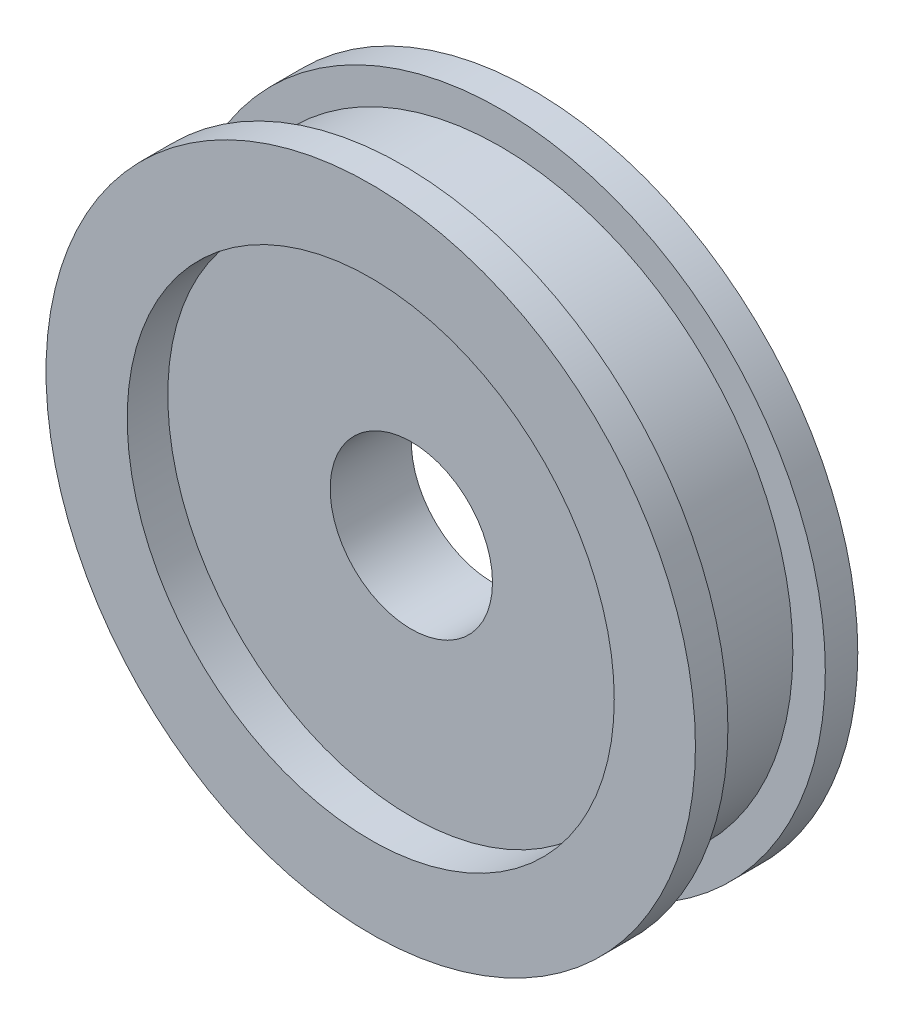
ISO-10303-21;
HEADER;
FILE_DESCRIPTION(('STEP AP214'),'2;1');
FILE_NAME('part.step','',(''),(''),'','','');
FILE_SCHEMA(('AUTOMOTIVE_DESIGN { 1 0 10303 214 1 1 1 1 }'));
ENDSEC;
DATA;
#1=APPLICATION_CONTEXT('core data for automotive mechanical design processes');
#2=APPLICATION_PROTOCOL_DEFINITION('international standard','automotive_design',2000,#1);
#3=PRODUCT_CONTEXT('',#1,'mechanical');
#4=PRODUCT('Part','Part','',(#3));
#5=PRODUCT_RELATED_PRODUCT_CATEGORY('part','',(#4));
#6=PRODUCT_DEFINITION_FORMATION('','',#4);
#7=PRODUCT_DEFINITION_CONTEXT('part definition',#1,'design');
#8=PRODUCT_DEFINITION('design','',#6,#7);
#9=PRODUCT_DEFINITION_SHAPE('','',#8);
#10=(LENGTH_UNIT() NAMED_UNIT(*) SI_UNIT(.MILLI.,.METRE.));
#11=(NAMED_UNIT(*) PLANE_ANGLE_UNIT() SI_UNIT($,.RADIAN.));
#12=(NAMED_UNIT(*) SI_UNIT($,.STERADIAN.) SOLID_ANGLE_UNIT());
#13=UNCERTAINTY_MEASURE_WITH_UNIT(LENGTH_MEASURE(1.E-05),#10,'distance_accuracy_value','');
#14=(GEOMETRIC_REPRESENTATION_CONTEXT(3) GLOBAL_UNCERTAINTY_ASSIGNED_CONTEXT((#13)) GLOBAL_UNIT_ASSIGNED_CONTEXT((#10,
#11,#12)) REPRESENTATION_CONTEXT('',''));
#15=CARTESIAN_POINT('',(0.,0.,0.));
#16=DIRECTION('',(0.,0.,1.));
#17=DIRECTION('',(1.,0.,0.));
#18=AXIS2_PLACEMENT_3D('',#15,#16,#17);
#19=CARTESIAN_POINT('',(0.,0.,5.));
#20=DIRECTION('',(0.,0.,-1.));
#21=DIRECTION('',(-1.,0.,0.));
#22=AXIS2_PLACEMENT_3D('',#19,#20,#21);
#23=CYLINDRICAL_SURFACE('',#22,20.);
#24=CARTESIAN_POINT('',(0.,0.,5.));
#25=DIRECTION('',(0.,0.,1.));
#26=DIRECTION('',(1.,0.,0.));
#27=AXIS2_PLACEMENT_3D('',#24,#25,#26);
#28=CIRCLE('',#27,20.);
#29=CARTESIAN_POINT('',(20.,0.,5.));
#30=VERTEX_POINT('',#29);
#31=EDGE_CURVE('E46',#30,#30,#28,.T.);
#32=ORIENTED_EDGE('',*,*,#31,.F.);
#33=EDGE_LOOP('',(#32));
#34=FACE_BOUND('',#33,.T.);
#35=CARTESIAN_POINT('',(0.,0.,3.));
#36=DIRECTION('',(0.,0.,1.));
#37=DIRECTION('',(1.,0.,0.));
#38=AXIS2_PLACEMENT_3D('',#35,#36,#37);
#39=CIRCLE('',#38,20.);
#40=CARTESIAN_POINT('',(20.,0.,3.));
#41=VERTEX_POINT('',#40);
#42=EDGE_CURVE('E67',#41,#41,#39,.T.);
#43=ORIENTED_EDGE('',*,*,#42,.T.);
#44=EDGE_LOOP('',(#43));
#45=FACE_BOUND('',#44,.T.);
#46=ADVANCED_FACE('F39',(#34,#45),#23,.T.);
#47=CARTESIAN_POINT('',(0.,0.,-5.));
#48=DIRECTION('',(0.,0.,1.));
#49=DIRECTION('',(1.,0.,0.));
#50=AXIS2_PLACEMENT_3D('',#47,#48,#49);
#51=CIRCLE('',#50,20.);
#52=CARTESIAN_POINT('',(20.,0.,-5.));
#53=VERTEX_POINT('',#52);
#54=EDGE_CURVE('E50',#53,#53,#51,.T.);
#55=ORIENTED_EDGE('',*,*,#54,.T.);
#56=EDGE_LOOP('',(#55));
#57=FACE_BOUND('',#56,.T.);
#58=CARTESIAN_POINT('',(0.,0.,-3.));
#59=DIRECTION('',(0.,0.,1.));
#60=DIRECTION('',(1.,0.,0.));
#61=AXIS2_PLACEMENT_3D('',#58,#59,#60);
#62=CIRCLE('',#61,20.);
#63=CARTESIAN_POINT('',(20.,0.,-3.));
#64=VERTEX_POINT('',#63);
#65=EDGE_CURVE('E76',#64,#64,#62,.T.);
#66=ORIENTED_EDGE('',*,*,#65,.F.);
#67=EDGE_LOOP('',(#66));
#68=FACE_BOUND('',#67,.T.);
#69=ADVANCED_FACE('F83',(#57,#68),#23,.T.);
#70=CARTESIAN_POINT('',(0.,0.,0.));
#71=DIRECTION('',(0.,0.,1.));
#72=DIRECTION('',(1.,0.,0.));
#73=AXIS2_PLACEMENT_3D('',#70,#71,#72);
#74=CYLINDRICAL_SURFACE('',#73,15.);
#75=CARTESIAN_POINT('',(0.,0.,-5.));
#76=DIRECTION('',(0.,0.,-1.));
#77=DIRECTION('',(-1.,0.,0.));
#78=AXIS2_PLACEMENT_3D('',#75,#76,#77);
#79=CIRCLE('',#78,15.);
#80=CARTESIAN_POINT('',(-15.,0.,-5.));
#81=VERTEX_POINT('',#80);
#82=EDGE_CURVE('E58',#81,#81,#79,.T.);
#83=ORIENTED_EDGE('',*,*,#82,.T.);
#84=EDGE_LOOP('',(#83));
#85=FACE_BOUND('',#84,.T.);
#86=CARTESIAN_POINT('',(0.,0.,-2.5));
#87=DIRECTION('',(0.,0.,1.));
#88=DIRECTION('',(1.,0.,0.));
#89=AXIS2_PLACEMENT_3D('',#86,#87,#88);
#90=CIRCLE('',#89,15.);
#91=CARTESIAN_POINT('',(15.,0.,-2.5));
#92=VERTEX_POINT('',#91);
#93=EDGE_CURVE('E10',#92,#92,#90,.F.);
#94=ORIENTED_EDGE('',*,*,#93,.F.);
#95=EDGE_LOOP('',(#94));
#96=FACE_BOUND('',#95,.T.);
#97=ADVANCED_FACE('F85',(#85,#96),#74,.F.);
#98=CARTESIAN_POINT('',(0.,0.,5.));
#99=DIRECTION('',(0.,0.,1.));
#100=DIRECTION('',(1.,0.,0.));
#101=AXIS2_PLACEMENT_3D('',#98,#99,#100);
#102=PLANE('',#101);
#103=CARTESIAN_POINT('',(0.,0.,5.));
#104=DIRECTION('',(0.,0.,1.));
#105=DIRECTION('',(1.,0.,0.));
#106=AXIS2_PLACEMENT_3D('',#103,#104,#105);
#107=CIRCLE('',#106,15.);
#108=CARTESIAN_POINT('',(15.,0.,5.));
#109=VERTEX_POINT('',#108);
#110=EDGE_CURVE('E54',#109,#109,#107,.T.);
#111=ORIENTED_EDGE('',*,*,#110,.F.);
#112=EDGE_LOOP('',(#111));
#113=FACE_BOUND('',#112,.T.);
#114=ORIENTED_EDGE('',*,*,#31,.T.);
#115=EDGE_LOOP('',(#114));
#116=FACE_BOUND('',#115,.T.);
#117=ADVANCED_FACE('F92',(#113,#116),#102,.T.);
#118=CARTESIAN_POINT('',(0.,0.,-5.));
#119=DIRECTION('',(0.,0.,1.));
#120=DIRECTION('',(1.,0.,0.));
#121=AXIS2_PLACEMENT_3D('',#118,#119,#120);
#122=PLANE('',#121);
#123=ORIENTED_EDGE('',*,*,#82,.F.);
#124=EDGE_LOOP('',(#123));
#125=FACE_BOUND('',#124,.T.);
#126=ORIENTED_EDGE('',*,*,#54,.F.);
#127=EDGE_LOOP('',(#126));
#128=FACE_BOUND('',#127,.T.);
#129=ADVANCED_FACE('F99',(#125,#128),#122,.F.);
#130=CARTESIAN_POINT('',(0.,0.,2.5));
#131=DIRECTION('',(0.,0.,1.));
#132=DIRECTION('',(1.,0.,0.));
#133=AXIS2_PLACEMENT_3D('',#130,#131,#132);
#134=CIRCLE('',#133,15.);
#135=CARTESIAN_POINT('',(15.,0.,2.5));
#136=VERTEX_POINT('',#135);
#137=EDGE_CURVE('E61',#136,#136,#134,.T.);
#138=ORIENTED_EDGE('',*,*,#137,.F.);
#139=EDGE_LOOP('',(#138));
#140=FACE_BOUND('',#139,.T.);
#141=ORIENTED_EDGE('',*,*,#110,.T.);
#142=EDGE_LOOP('',(#141));
#143=FACE_BOUND('',#142,.T.);
#144=ADVANCED_FACE('F95',(#140,#143),#74,.F.);
#145=CARTESIAN_POINT('',(0.,0.,-2.5));
#146=DIRECTION('',(0.,0.,1.));
#147=DIRECTION('',(1.,0.,0.));
#148=AXIS2_PLACEMENT_3D('',#145,#146,#147);
#149=PLANE('',#148);
#150=CARTESIAN_POINT('',(0.,0.,-2.5));
#151=DIRECTION('',(0.,0.,1.));
#152=DIRECTION('',(1.,0.,0.));
#153=AXIS2_PLACEMENT_3D('',#150,#151,#152);
#154=CIRCLE('',#153,5.);
#155=CARTESIAN_POINT('',(5.,0.,-2.5));
#156=VERTEX_POINT('',#155);
#157=EDGE_CURVE('E42',#156,#156,#154,.T.);
#158=ORIENTED_EDGE('',*,*,#157,.T.);
#159=EDGE_LOOP('',(#158));
#160=FACE_BOUND('',#159,.T.);
#161=ORIENTED_EDGE('',*,*,#93,.T.);
#162=EDGE_LOOP('',(#161));
#163=FACE_BOUND('',#162,.T.);
#164=ADVANCED_FACE('F106',(#160,#163),#149,.F.);
#165=CARTESIAN_POINT('',(0.,0.,2.5));
#166=DIRECTION('',(0.,0.,1.));
#167=DIRECTION('',(1.,0.,0.));
#168=AXIS2_PLACEMENT_3D('',#165,#166,#167);
#169=PLANE('',#168);
#170=CARTESIAN_POINT('',(0.,0.,2.5));
#171=DIRECTION('',(0.,0.,1.));
#172=DIRECTION('',(1.,0.,0.));
#173=AXIS2_PLACEMENT_3D('',#170,#171,#172);
#174=CIRCLE('',#173,5.);
#175=CARTESIAN_POINT('',(5.,0.,2.5));
#176=VERTEX_POINT('',#175);
#177=EDGE_CURVE('E64',#176,#176,#174,.T.);
#178=ORIENTED_EDGE('',*,*,#177,.F.);
#179=EDGE_LOOP('',(#178));
#180=FACE_BOUND('',#179,.T.);
#181=ORIENTED_EDGE('',*,*,#137,.T.);
#182=EDGE_LOOP('',(#181));
#183=FACE_BOUND('',#182,.T.);
#184=ADVANCED_FACE('F114',(#180,#183),#169,.T.);
#185=CARTESIAN_POINT('',(0.,0.,-5.));
#186=DIRECTION('',(0.,0.,1.));
#187=DIRECTION('',(1.,0.,0.));
#188=AXIS2_PLACEMENT_3D('',#185,#186,#187);
#189=CYLINDRICAL_SURFACE('',#188,5.);
#190=ORIENTED_EDGE('',*,*,#177,.T.);
#191=EDGE_LOOP('',(#190));
#192=FACE_BOUND('',#191,.T.);
#193=ORIENTED_EDGE('',*,*,#157,.F.);
#194=EDGE_LOOP('',(#193));
#195=FACE_BOUND('',#194,.T.);
#196=ADVANCED_FACE('F118',(#192,#195),#189,.F.);
#197=CARTESIAN_POINT('',(-20.,0.,3.));
#198=DIRECTION('',(0.,0.,-1.));
#199=DIRECTION('',(-1.,0.,0.));
#200=AXIS2_PLACEMENT_3D('',#197,#198,#199);
#201=PLANE('',#200);
#202=CARTESIAN_POINT('',(0.,0.,3.));
#203=DIRECTION('',(0.,0.,1.));
#204=DIRECTION('',(1.,0.,0.));
#205=AXIS2_PLACEMENT_3D('',#202,#203,#204);
#206=CIRCLE('',#205,18.);
#207=CARTESIAN_POINT('',(18.,0.,3.));
#208=VERTEX_POINT('',#207);
#209=EDGE_CURVE('E70',#208,#208,#206,.T.);
#210=ORIENTED_EDGE('',*,*,#209,.T.);
#211=EDGE_LOOP('',(#210));
#212=FACE_BOUND('',#211,.T.);
#213=ORIENTED_EDGE('',*,*,#42,.F.);
#214=EDGE_LOOP('',(#213));
#215=FACE_BOUND('',#214,.T.);
#216=ADVANCED_FACE('F122',(#212,#215),#201,.T.);
#217=CARTESIAN_POINT('',(0.,0.,0.));
#218=DIRECTION('',(0.,0.,1.));
#219=DIRECTION('',(1.,0.,0.));
#220=AXIS2_PLACEMENT_3D('',#217,#218,#219);
#221=CYLINDRICAL_SURFACE('',#220,18.);
#222=CARTESIAN_POINT('',(0.,0.,-3.));
#223=DIRECTION('',(0.,0.,1.));
#224=DIRECTION('',(1.,0.,0.));
#225=AXIS2_PLACEMENT_3D('',#222,#223,#224);
#226=CIRCLE('',#225,18.);
#227=CARTESIAN_POINT('',(18.,0.,-3.));
#228=VERTEX_POINT('',#227);
#229=EDGE_CURVE('E73',#228,#228,#226,.T.);
#230=ORIENTED_EDGE('',*,*,#229,.T.);
#231=EDGE_LOOP('',(#230));
#232=FACE_BOUND('',#231,.T.);
#233=ORIENTED_EDGE('',*,*,#209,.F.);
#234=EDGE_LOOP('',(#233));
#235=FACE_BOUND('',#234,.T.);
#236=ADVANCED_FACE('F125',(#232,#235),#221,.T.);
#237=CARTESIAN_POINT('',(-18.,0.,-3.));
#238=DIRECTION('',(0.,0.,1.));
#239=DIRECTION('',(1.,0.,0.));
#240=AXIS2_PLACEMENT_3D('',#237,#238,#239);
#241=PLANE('',#240);
#242=ORIENTED_EDGE('',*,*,#65,.T.);
#243=EDGE_LOOP('',(#242));
#244=FACE_BOUND('',#243,.T.);
#245=ORIENTED_EDGE('',*,*,#229,.F.);
#246=EDGE_LOOP('',(#245));
#247=FACE_BOUND('',#246,.T.);
#248=ADVANCED_FACE('F80',(#244,#247),#241,.T.);
#249=CLOSED_SHELL('',(#46,#69,#97,#117,#129,#144,#164,#184,#196,#216,#236,#248));
#250=MANIFOLD_SOLID_BREP('B2',#249);
#251=ADVANCED_BREP_SHAPE_REPRESENTATION('',(#18,#250),#14);
#252=SHAPE_DEFINITION_REPRESENTATION(#9,#251);
ENDSEC;
END-ISO-10303-21;
